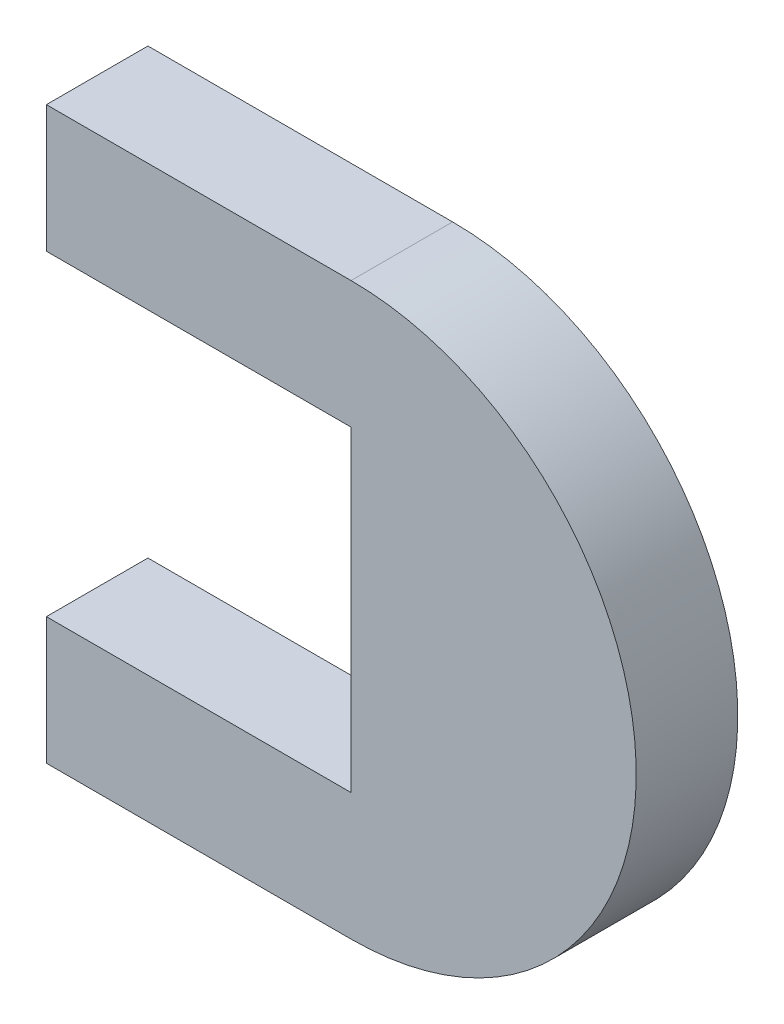
ISO-10303-21;
HEADER;
FILE_DESCRIPTION(('STEP AP214'),'2;1');
FILE_NAME('part.step','',(''),(''),'','','');
FILE_SCHEMA(('AUTOMOTIVE_DESIGN { 1 0 10303 214 1 1 1 1 }'));
ENDSEC;
DATA;
#1=APPLICATION_CONTEXT('core data for automotive mechanical design processes');
#2=APPLICATION_PROTOCOL_DEFINITION('international standard','automotive_design',2000,#1);
#3=PRODUCT_CONTEXT('',#1,'mechanical');
#4=PRODUCT('Part','Part','',(#3));
#5=PRODUCT_RELATED_PRODUCT_CATEGORY('part','',(#4));
#6=PRODUCT_DEFINITION_FORMATION('','',#4);
#7=PRODUCT_DEFINITION_CONTEXT('part definition',#1,'design');
#8=PRODUCT_DEFINITION('design','',#6,#7);
#9=PRODUCT_DEFINITION_SHAPE('','',#8);
#10=(LENGTH_UNIT() NAMED_UNIT(*) SI_UNIT(.MILLI.,.METRE.));
#11=(NAMED_UNIT(*) PLANE_ANGLE_UNIT() SI_UNIT($,.RADIAN.));
#12=(NAMED_UNIT(*) SI_UNIT($,.STERADIAN.) SOLID_ANGLE_UNIT());
#13=UNCERTAINTY_MEASURE_WITH_UNIT(LENGTH_MEASURE(1.E-05),#10,'distance_accuracy_value','');
#14=(GEOMETRIC_REPRESENTATION_CONTEXT(3) GLOBAL_UNCERTAINTY_ASSIGNED_CONTEXT((#13)) GLOBAL_UNIT_ASSIGNED_CONTEXT((#10,
#11,#12)) REPRESENTATION_CONTEXT('',''));
#15=CARTESIAN_POINT('',(0.,0.,0.));
#16=DIRECTION('',(0.,0.,1.));
#17=DIRECTION('',(1.,0.,0.));
#18=AXIS2_PLACEMENT_3D('',#15,#16,#17);
#19=CARTESIAN_POINT('',(-30.,15.58,10.));
#20=DIRECTION('',(1.,0.,0.));
#21=DIRECTION('',(0.,0.,-1.));
#22=AXIS2_PLACEMENT_3D('',#19,#20,#21);
#23=PLANE('',#22);
#24=DIRECTION('',(0.,-1.,0.));
#25=VECTOR('',#24,1.);
#26=CARTESIAN_POINT('',(-30.,15.58,0.));
#27=LINE('',#26,#25);
#28=CARTESIAN_POINT('',(-30.,28.08,0.));
#29=VERTEX_POINT('',#28);
#30=CARTESIAN_POINT('',(-30.,15.58,0.));
#31=VERTEX_POINT('',#30);
#32=EDGE_CURVE('E135',#29,#31,#27,.T.);
#33=ORIENTED_EDGE('',*,*,#32,.T.);
#34=DIRECTION('',(0.,0.,-1.));
#35=VECTOR('',#34,1.);
#36=CARTESIAN_POINT('',(-30.,15.58,10.));
#37=LINE('',#36,#35);
#38=CARTESIAN_POINT('',(-30.,15.58,10.));
#39=VERTEX_POINT('',#38);
#40=EDGE_CURVE('E11',#39,#31,#37,.T.);
#41=ORIENTED_EDGE('',*,*,#40,.F.);
#42=DIRECTION('',(0.,-1.,0.));
#43=VECTOR('',#42,1.);
#44=CARTESIAN_POINT('',(-30.,15.58,10.));
#45=LINE('',#44,#43);
#46=CARTESIAN_POINT('',(-30.,28.08,10.));
#47=VERTEX_POINT('',#46);
#48=EDGE_CURVE('E149',#47,#39,#45,.T.);
#49=ORIENTED_EDGE('',*,*,#48,.F.);
#50=DIRECTION('',(0.,0.,-1.));
#51=VECTOR('',#50,1.);
#52=CARTESIAN_POINT('',(-30.,28.08,10.));
#53=LINE('',#52,#51);
#54=EDGE_CURVE('E131',#47,#29,#53,.T.);
#55=ORIENTED_EDGE('',*,*,#54,.T.);
#56=EDGE_LOOP('',(#33,#41,#49,#55));
#57=FACE_BOUND('',#56,.T.);
#58=ADVANCED_FACE('F39',(#57),#23,.F.);
#59=CARTESIAN_POINT('',(-30.,15.58,10.));
#60=DIRECTION('',(0.,1.,0.));
#61=DIRECTION('',(0.,0.,1.));
#62=AXIS2_PLACEMENT_3D('',#59,#60,#61);
#63=PLANE('',#62);
#64=DIRECTION('',(1.,0.,0.));
#65=VECTOR('',#64,1.);
#66=CARTESIAN_POINT('',(-30.,15.58,0.));
#67=LINE('',#66,#65);
#68=CARTESIAN_POINT('',(0.,15.58,0.));
#69=VERTEX_POINT('',#68);
#70=EDGE_CURVE('E138',#31,#69,#67,.T.);
#71=ORIENTED_EDGE('',*,*,#70,.T.);
#72=DIRECTION('',(0.,0.,-1.));
#73=VECTOR('',#72,1.);
#74=CARTESIAN_POINT('',(0.,15.58,10.));
#75=LINE('',#74,#73);
#76=CARTESIAN_POINT('',(0.,15.58,10.));
#77=VERTEX_POINT('',#76);
#78=EDGE_CURVE('E47',#77,#69,#75,.T.);
#79=ORIENTED_EDGE('',*,*,#78,.F.);
#80=DIRECTION('',(1.,0.,0.));
#81=VECTOR('',#80,1.);
#82=CARTESIAN_POINT('',(-30.,15.58,10.));
#83=LINE('',#82,#81);
#84=EDGE_CURVE('E98',#39,#77,#83,.T.);
#85=ORIENTED_EDGE('',*,*,#84,.F.);
#86=ORIENTED_EDGE('',*,*,#40,.T.);
#87=EDGE_LOOP('',(#71,#79,#85,#86));
#88=FACE_BOUND('',#87,.T.);
#89=ADVANCED_FACE('F184',(#88),#63,.F.);
#90=CARTESIAN_POINT('',(0.,15.58,10.));
#91=DIRECTION('',(1.,0.,0.));
#92=DIRECTION('',(0.,1.,0.));
#93=AXIS2_PLACEMENT_3D('',#90,#91,#92);
#94=PLANE('',#93);
#95=DIRECTION('',(0.,-1.,0.));
#96=VECTOR('',#95,1.);
#97=CARTESIAN_POINT('',(0.,15.58,0.));
#98=LINE('',#97,#96);
#99=CARTESIAN_POINT('',(0.,-15.58,0.));
#100=VERTEX_POINT('',#99);
#101=EDGE_CURVE('E140',#69,#100,#98,.T.);
#102=ORIENTED_EDGE('',*,*,#101,.T.);
#103=DIRECTION('',(0.,0.,-1.));
#104=VECTOR('',#103,1.);
#105=CARTESIAN_POINT('',(0.,-15.58,10.));
#106=LINE('',#105,#104);
#107=CARTESIAN_POINT('',(0.,-15.58,10.));
#108=VERTEX_POINT('',#107);
#109=EDGE_CURVE('E156',#108,#100,#106,.T.);
#110=ORIENTED_EDGE('',*,*,#109,.F.);
#111=DIRECTION('',(0.,-1.,0.));
#112=VECTOR('',#111,1.);
#113=CARTESIAN_POINT('',(0.,15.58,10.));
#114=LINE('',#113,#112);
#115=EDGE_CURVE('E164',#77,#108,#114,.T.);
#116=ORIENTED_EDGE('',*,*,#115,.F.);
#117=ORIENTED_EDGE('',*,*,#78,.T.);
#118=EDGE_LOOP('',(#102,#110,#116,#117));
#119=FACE_BOUND('',#118,.T.);
#120=ADVANCED_FACE('F162',(#119),#94,.F.);
#121=CARTESIAN_POINT('',(0.,-15.58,10.));
#122=DIRECTION('',(0.,-1.,0.));
#123=DIRECTION('',(1.,0.,0.));
#124=AXIS2_PLACEMENT_3D('',#121,#122,#123);
#125=PLANE('',#124);
#126=DIRECTION('',(-1.,0.,0.));
#127=VECTOR('',#126,1.);
#128=CARTESIAN_POINT('',(0.,-15.58,0.));
#129=LINE('',#128,#127);
#130=CARTESIAN_POINT('',(-30.,-15.58,0.));
#131=VERTEX_POINT('',#130);
#132=EDGE_CURVE('E142',#100,#131,#129,.T.);
#133=ORIENTED_EDGE('',*,*,#132,.T.);
#134=DIRECTION('',(0.,0.,-1.));
#135=VECTOR('',#134,1.);
#136=CARTESIAN_POINT('',(-30.,-15.58,10.));
#137=LINE('',#136,#135);
#138=CARTESIAN_POINT('',(-30.,-15.58,10.));
#139=VERTEX_POINT('',#138);
#140=EDGE_CURVE('E153',#139,#131,#137,.T.);
#141=ORIENTED_EDGE('',*,*,#140,.F.);
#142=DIRECTION('',(-1.,0.,0.));
#143=VECTOR('',#142,1.);
#144=CARTESIAN_POINT('',(0.,-15.58,10.));
#145=LINE('',#144,#143);
#146=EDGE_CURVE('E176',#108,#139,#145,.T.);
#147=ORIENTED_EDGE('',*,*,#146,.F.);
#148=ORIENTED_EDGE('',*,*,#109,.T.);
#149=EDGE_LOOP('',(#133,#141,#147,#148));
#150=FACE_BOUND('',#149,.T.);
#151=ADVANCED_FACE('F172',(#150),#125,.F.);
#152=CARTESIAN_POINT('',(-30.,-15.58,10.));
#153=DIRECTION('',(1.,0.,0.));
#154=DIRECTION('',(0.,1.,0.));
#155=AXIS2_PLACEMENT_3D('',#152,#153,#154);
#156=PLANE('',#155);
#157=DIRECTION('',(0.,-1.,0.));
#158=VECTOR('',#157,1.);
#159=CARTESIAN_POINT('',(-30.,-15.58,0.));
#160=LINE('',#159,#158);
#161=CARTESIAN_POINT('',(-30.,-28.08,0.));
#162=VERTEX_POINT('',#161);
#163=EDGE_CURVE('E144',#131,#162,#160,.T.);
#164=ORIENTED_EDGE('',*,*,#163,.T.);
#165=DIRECTION('',(0.,0.,-1.));
#166=VECTOR('',#165,1.);
#167=CARTESIAN_POINT('',(-30.,-28.08,10.));
#168=LINE('',#167,#166);
#169=CARTESIAN_POINT('',(-30.,-28.08,10.));
#170=VERTEX_POINT('',#169);
#171=EDGE_CURVE('E126',#170,#162,#168,.T.);
#172=ORIENTED_EDGE('',*,*,#171,.F.);
#173=DIRECTION('',(0.,-1.,0.));
#174=VECTOR('',#173,1.);
#175=CARTESIAN_POINT('',(-30.,-15.58,10.));
#176=LINE('',#175,#174);
#177=EDGE_CURVE('E117',#139,#170,#176,.T.);
#178=ORIENTED_EDGE('',*,*,#177,.F.);
#179=ORIENTED_EDGE('',*,*,#140,.T.);
#180=EDGE_LOOP('',(#164,#172,#178,#179));
#181=FACE_BOUND('',#180,.T.);
#182=ADVANCED_FACE('F175',(#181),#156,.F.);
#183=CARTESIAN_POINT('',(-30.,-28.08,10.));
#184=DIRECTION('',(0.,1.,0.));
#185=DIRECTION('',(0.,0.,1.));
#186=AXIS2_PLACEMENT_3D('',#183,#184,#185);
#187=PLANE('',#186);
#188=DIRECTION('',(1.,0.,0.));
#189=VECTOR('',#188,1.);
#190=CARTESIAN_POINT('',(-30.,-28.08,0.));
#191=LINE('',#190,#189);
#192=CARTESIAN_POINT('',(0.,-28.08,0.));
#193=VERTEX_POINT('',#192);
#194=EDGE_CURVE('E125',#162,#193,#191,.T.);
#195=ORIENTED_EDGE('',*,*,#194,.T.);
#196=DIRECTION('',(0.,0.,-1.));
#197=VECTOR('',#196,1.);
#198=CARTESIAN_POINT('',(0.,-28.08,10.));
#199=LINE('',#198,#197);
#200=CARTESIAN_POINT('',(0.,-28.08,10.));
#201=VERTEX_POINT('',#200);
#202=EDGE_CURVE('E122',#201,#193,#199,.T.);
#203=ORIENTED_EDGE('',*,*,#202,.F.);
#204=DIRECTION('',(1.,0.,0.));
#205=VECTOR('',#204,1.);
#206=CARTESIAN_POINT('',(-30.,-28.08,10.));
#207=LINE('',#206,#205);
#208=EDGE_CURVE('E111',#170,#201,#207,.T.);
#209=ORIENTED_EDGE('',*,*,#208,.F.);
#210=ORIENTED_EDGE('',*,*,#171,.T.);
#211=EDGE_LOOP('',(#195,#203,#209,#210));
#212=FACE_BOUND('',#211,.T.);
#213=ADVANCED_FACE('F123',(#212),#187,.F.);
#214=CARTESIAN_POINT('',(0.,0.,10.));
#215=DIRECTION('',(0.,0.,-1.));
#216=DIRECTION('',(-1.,0.,0.));
#217=AXIS2_PLACEMENT_3D('',#214,#215,#216);
#218=CYLINDRICAL_SURFACE('',#217,28.08);
#219=CARTESIAN_POINT('',(0.,0.,0.));
#220=DIRECTION('',(0.,0.,1.));
#221=DIRECTION('',(-1.,0.,0.));
#222=AXIS2_PLACEMENT_3D('',#219,#220,#221);
#223=CIRCLE('',#222,28.08);
#224=CARTESIAN_POINT('',(0.,28.08,0.));
#225=VERTEX_POINT('',#224);
#226=EDGE_CURVE('E84',#193,#225,#223,.T.);
#227=ORIENTED_EDGE('',*,*,#226,.T.);
#228=DIRECTION('',(0.,0.,-1.));
#229=VECTOR('',#228,1.);
#230=CARTESIAN_POINT('',(0.,28.08,10.));
#231=LINE('',#230,#229);
#232=CARTESIAN_POINT('',(0.,28.08,10.));
#233=VERTEX_POINT('',#232);
#234=EDGE_CURVE('E127',#233,#225,#231,.T.);
#235=ORIENTED_EDGE('',*,*,#234,.F.);
#236=CARTESIAN_POINT('',(0.,0.,10.));
#237=DIRECTION('',(0.,0.,1.));
#238=DIRECTION('',(-1.,0.,0.));
#239=AXIS2_PLACEMENT_3D('',#236,#237,#238);
#240=CIRCLE('',#239,28.08);
#241=EDGE_CURVE('E115',#201,#233,#240,.T.);
#242=ORIENTED_EDGE('',*,*,#241,.F.);
#243=ORIENTED_EDGE('',*,*,#202,.T.);
#244=EDGE_LOOP('',(#227,#235,#242,#243));
#245=FACE_BOUND('',#244,.T.);
#246=ADVANCED_FACE('F129',(#245),#218,.T.);
#247=CARTESIAN_POINT('',(-30.,28.08,10.));
#248=DIRECTION('',(0.,-1.,0.));
#249=DIRECTION('',(0.,0.,-1.));
#250=AXIS2_PLACEMENT_3D('',#247,#248,#249);
#251=PLANE('',#250);
#252=DIRECTION('',(-1.,0.,0.));
#253=VECTOR('',#252,1.);
#254=CARTESIAN_POINT('',(-30.,28.08,0.));
#255=LINE('',#254,#253);
#256=EDGE_CURVE('E90',#225,#29,#255,.T.);
#257=ORIENTED_EDGE('',*,*,#256,.T.);
#258=ORIENTED_EDGE('',*,*,#54,.F.);
#259=DIRECTION('',(-1.,0.,0.));
#260=VECTOR('',#259,1.);
#261=CARTESIAN_POINT('',(-30.,28.08,10.));
#262=LINE('',#261,#260);
#263=EDGE_CURVE('E55',#233,#47,#262,.T.);
#264=ORIENTED_EDGE('',*,*,#263,.F.);
#265=ORIENTED_EDGE('',*,*,#234,.T.);
#266=EDGE_LOOP('',(#257,#258,#264,#265));
#267=FACE_BOUND('',#266,.T.);
#268=ADVANCED_FACE('F200',(#267),#251,.F.);
#269=CARTESIAN_POINT('',(0.,0.,10.));
#270=DIRECTION('',(0.,0.,-1.));
#271=DIRECTION('',(-1.,0.,0.));
#272=AXIS2_PLACEMENT_3D('',#269,#270,#271);
#273=PLANE('',#272);
#274=ORIENTED_EDGE('',*,*,#48,.T.);
#275=ORIENTED_EDGE('',*,*,#84,.T.);
#276=ORIENTED_EDGE('',*,*,#115,.T.);
#277=ORIENTED_EDGE('',*,*,#146,.T.);
#278=ORIENTED_EDGE('',*,*,#177,.T.);
#279=ORIENTED_EDGE('',*,*,#208,.T.);
#280=ORIENTED_EDGE('',*,*,#241,.T.);
#281=ORIENTED_EDGE('',*,*,#263,.T.);
#282=EDGE_LOOP('',(#274,#275,#276,#277,#278,#279,#280,#281));
#283=FACE_BOUND('',#282,.T.);
#284=ADVANCED_FACE('F113',(#283),#273,.F.);
#285=CARTESIAN_POINT('',(0.,0.,0.));
#286=DIRECTION('',(0.,0.,-1.));
#287=DIRECTION('',(-1.,0.,0.));
#288=AXIS2_PLACEMENT_3D('',#285,#286,#287);
#289=PLANE('',#288);
#290=ORIENTED_EDGE('',*,*,#32,.F.);
#291=ORIENTED_EDGE('',*,*,#256,.F.);
#292=ORIENTED_EDGE('',*,*,#226,.F.);
#293=ORIENTED_EDGE('',*,*,#194,.F.);
#294=ORIENTED_EDGE('',*,*,#163,.F.);
#295=ORIENTED_EDGE('',*,*,#132,.F.);
#296=ORIENTED_EDGE('',*,*,#101,.F.);
#297=ORIENTED_EDGE('',*,*,#70,.F.);
#298=EDGE_LOOP('',(#290,#291,#292,#293,#294,#295,#296,#297));
#299=FACE_BOUND('',#298,.T.);
#300=ADVANCED_FACE('F168',(#299),#289,.T.);
#301=CLOSED_SHELL('',(#58,#89,#120,#151,#182,#213,#246,#268,#284,#300));
#302=MANIFOLD_SOLID_BREP('B2',#301);
#303=ADVANCED_BREP_SHAPE_REPRESENTATION('',(#18,#302),#14);
#304=SHAPE_DEFINITION_REPRESENTATION(#9,#303);
ENDSEC;
END-ISO-10303-21;
